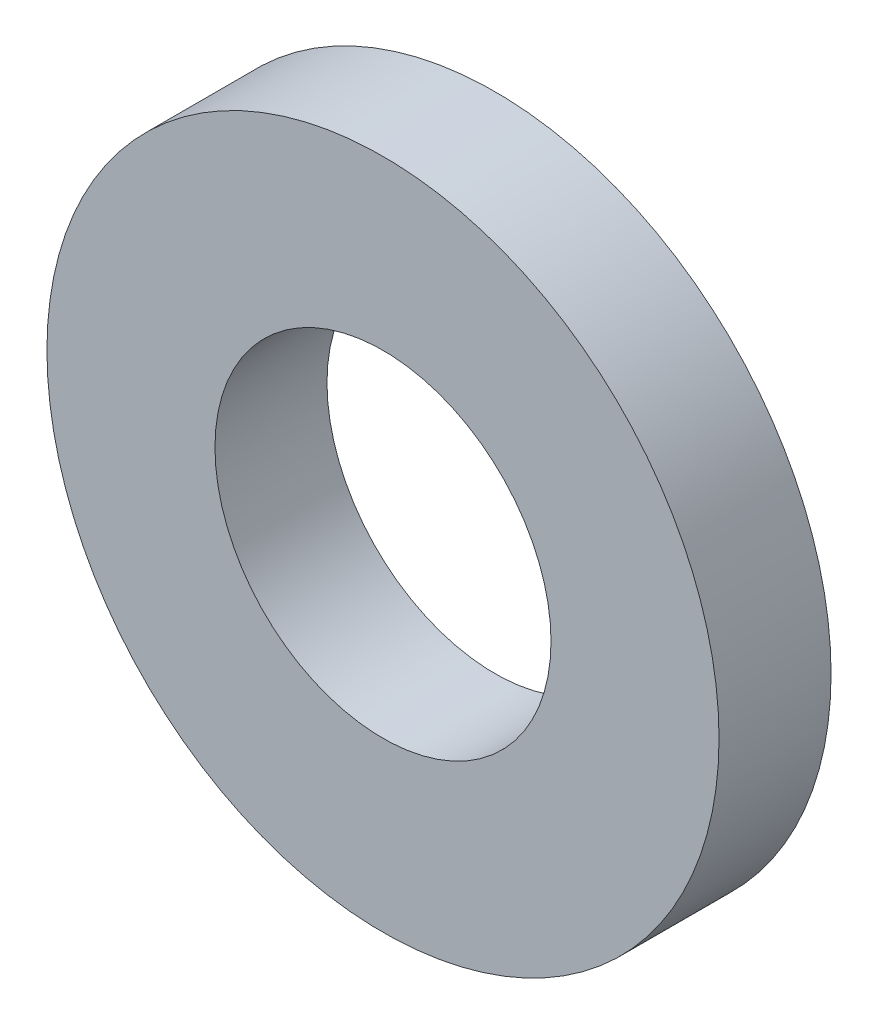
ISO-10303-21;
HEADER;
FILE_DESCRIPTION(('STEP AP214'),'2;1');
FILE_NAME('part.step','',(''),(''),'','','');
FILE_SCHEMA(('AUTOMOTIVE_DESIGN { 1 0 10303 214 1 1 1 1 }'));
ENDSEC;
DATA;
#1=APPLICATION_CONTEXT('core data for automotive mechanical design processes');
#2=APPLICATION_PROTOCOL_DEFINITION('international standard','automotive_design',2000,#1);
#3=PRODUCT_CONTEXT('',#1,'mechanical');
#4=PRODUCT('Part','Part','',(#3));
#5=PRODUCT_RELATED_PRODUCT_CATEGORY('part','',(#4));
#6=PRODUCT_DEFINITION_FORMATION('','',#4);
#7=PRODUCT_DEFINITION_CONTEXT('part definition',#1,'design');
#8=PRODUCT_DEFINITION('design','',#6,#7);
#9=PRODUCT_DEFINITION_SHAPE('','',#8);
#10=(LENGTH_UNIT() NAMED_UNIT(*) SI_UNIT(.MILLI.,.METRE.));
#11=(NAMED_UNIT(*) PLANE_ANGLE_UNIT() SI_UNIT($,.RADIAN.));
#12=(NAMED_UNIT(*) SI_UNIT($,.STERADIAN.) SOLID_ANGLE_UNIT());
#13=UNCERTAINTY_MEASURE_WITH_UNIT(LENGTH_MEASURE(1.E-05),#10,'distance_accuracy_value','');
#14=(GEOMETRIC_REPRESENTATION_CONTEXT(3) GLOBAL_UNCERTAINTY_ASSIGNED_CONTEXT((#13)) GLOBAL_UNIT_ASSIGNED_CONTEXT((#10,
#11,#12)) REPRESENTATION_CONTEXT('',''));
#15=CARTESIAN_POINT('',(0.,0.,0.));
#16=DIRECTION('',(0.,0.,1.));
#17=DIRECTION('',(1.,0.,0.));
#18=AXIS2_PLACEMENT_3D('',#15,#16,#17);
#19=CARTESIAN_POINT('',(0.,0.,1.));
#20=DIRECTION('',(0.,0.,-1.));
#21=DIRECTION('',(-1.,0.,0.));
#22=AXIS2_PLACEMENT_3D('',#19,#20,#21);
#23=CYLINDRICAL_SURFACE('',#22,3.);
#24=CARTESIAN_POINT('',(0.,0.,1.));
#25=DIRECTION('',(0.,0.,1.));
#26=DIRECTION('',(1.,0.,0.));
#27=AXIS2_PLACEMENT_3D('',#24,#25,#26);
#28=CIRCLE('',#27,3.);
#29=CARTESIAN_POINT('',(3.,0.,1.));
#30=VERTEX_POINT('',#29);
#31=EDGE_CURVE('E10',#30,#30,#28,.T.);
#32=ORIENTED_EDGE('',*,*,#31,.F.);
#33=EDGE_LOOP('',(#32));
#34=FACE_BOUND('',#33,.T.);
#35=CARTESIAN_POINT('',(0.,0.,0.));
#36=DIRECTION('',(0.,0.,1.));
#37=DIRECTION('',(1.,0.,0.));
#38=AXIS2_PLACEMENT_3D('',#35,#36,#37);
#39=CIRCLE('',#38,3.);
#40=CARTESIAN_POINT('',(3.,0.,0.));
#41=VERTEX_POINT('',#40);
#42=EDGE_CURVE('E40',#41,#41,#39,.T.);
#43=ORIENTED_EDGE('',*,*,#42,.T.);
#44=EDGE_LOOP('',(#43));
#45=FACE_BOUND('',#44,.T.);
#46=ADVANCED_FACE('F37',(#34,#45),#23,.T.);
#47=CARTESIAN_POINT('',(0.,0.,1.));
#48=DIRECTION('',(0.,0.,1.));
#49=DIRECTION('',(1.,0.,0.));
#50=AXIS2_PLACEMENT_3D('',#47,#48,#49);
#51=PLANE('',#50);
#52=CARTESIAN_POINT('',(0.,0.,1.));
#53=DIRECTION('',(0.,0.,-1.));
#54=DIRECTION('',(-1.,0.,0.));
#55=AXIS2_PLACEMENT_3D('',#52,#53,#54);
#56=CIRCLE('',#55,1.5);
#57=CARTESIAN_POINT('',(-1.5,0.,1.));
#58=VERTEX_POINT('',#57);
#59=EDGE_CURVE('E49',#58,#58,#56,.T.);
#60=ORIENTED_EDGE('',*,*,#59,.T.);
#61=EDGE_LOOP('',(#60));
#62=FACE_BOUND('',#61,.T.);
#63=ORIENTED_EDGE('',*,*,#31,.T.);
#64=EDGE_LOOP('',(#63));
#65=FACE_BOUND('',#64,.T.);
#66=ADVANCED_FACE('F59',(#62,#65),#51,.T.);
#67=CARTESIAN_POINT('',(0.,0.,0.));
#68=DIRECTION('',(0.,0.,1.));
#69=DIRECTION('',(1.,0.,0.));
#70=AXIS2_PLACEMENT_3D('',#67,#68,#69);
#71=PLANE('',#70);
#72=CARTESIAN_POINT('',(0.,0.,0.));
#73=DIRECTION('',(0.,0.,-1.));
#74=DIRECTION('',(-1.,0.,0.));
#75=AXIS2_PLACEMENT_3D('',#72,#73,#74);
#76=CIRCLE('',#75,1.5);
#77=CARTESIAN_POINT('',(-1.5,0.,0.));
#78=VERTEX_POINT('',#77);
#79=EDGE_CURVE('E51',#78,#78,#76,.T.);
#80=ORIENTED_EDGE('',*,*,#79,.F.);
#81=EDGE_LOOP('',(#80));
#82=FACE_BOUND('',#81,.T.);
#83=ORIENTED_EDGE('',*,*,#42,.F.);
#84=EDGE_LOOP('',(#83));
#85=FACE_BOUND('',#84,.T.);
#86=ADVANCED_FACE('F64',(#82,#85),#71,.F.);
#87=CARTESIAN_POINT('',(0.,0.,1.));
#88=DIRECTION('',(0.,0.,-1.));
#89=DIRECTION('',(-1.,0.,0.));
#90=AXIS2_PLACEMENT_3D('',#87,#88,#89);
#91=CYLINDRICAL_SURFACE('',#90,1.5);
#92=ORIENTED_EDGE('',*,*,#59,.F.);
#93=EDGE_LOOP('',(#92));
#94=FACE_BOUND('',#93,.T.);
#95=ORIENTED_EDGE('',*,*,#79,.T.);
#96=EDGE_LOOP('',(#95));
#97=FACE_BOUND('',#96,.T.);
#98=ADVANCED_FACE('F61',(#94,#97),#91,.F.);
#99=CLOSED_SHELL('',(#46,#66,#86,#98));
#100=MANIFOLD_SOLID_BREP('B2',#99);
#101=ADVANCED_BREP_SHAPE_REPRESENTATION('',(#18,#100),#14);
#102=SHAPE_DEFINITION_REPRESENTATION(#9,#101);
ENDSEC;
END-ISO-10303-21;
